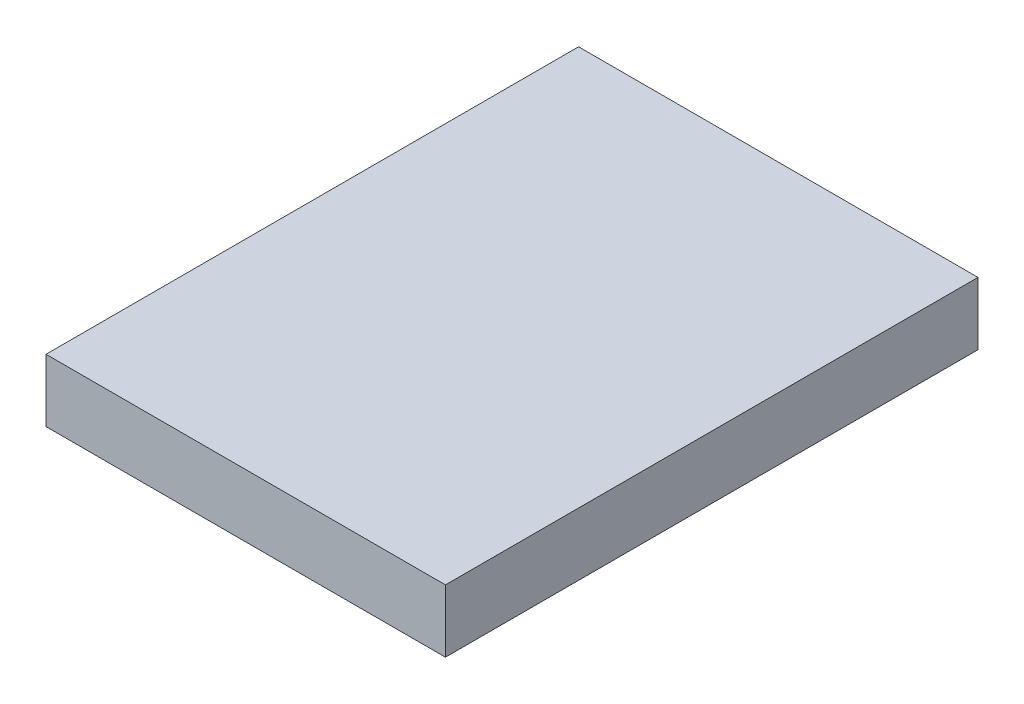
ISO-10303-21;
HEADER;
FILE_DESCRIPTION(('STEP AP214'),'2;1');
FILE_NAME('part.step','',(''),(''),'','','');
FILE_SCHEMA(('AUTOMOTIVE_DESIGN { 1 0 10303 214 1 1 1 1 }'));
ENDSEC;
DATA;
#1=APPLICATION_CONTEXT('core data for automotive mechanical design processes');
#2=APPLICATION_PROTOCOL_DEFINITION('international standard','automotive_design',2000,#1);
#3=PRODUCT_CONTEXT('',#1,'mechanical');
#4=PRODUCT('Part','Part','',(#3));
#5=PRODUCT_RELATED_PRODUCT_CATEGORY('part','',(#4));
#6=PRODUCT_DEFINITION_FORMATION('','',#4);
#7=PRODUCT_DEFINITION_CONTEXT('part definition',#1,'design');
#8=PRODUCT_DEFINITION('design','',#6,#7);
#9=PRODUCT_DEFINITION_SHAPE('','',#8);
#10=(LENGTH_UNIT() NAMED_UNIT(*) SI_UNIT(.MILLI.,.METRE.));
#11=(NAMED_UNIT(*) PLANE_ANGLE_UNIT() SI_UNIT($,.RADIAN.));
#12=(NAMED_UNIT(*) SI_UNIT($,.STERADIAN.) SOLID_ANGLE_UNIT());
#13=UNCERTAINTY_MEASURE_WITH_UNIT(LENGTH_MEASURE(1.E-05),#10,'distance_accuracy_value','');
#14=(GEOMETRIC_REPRESENTATION_CONTEXT(3) GLOBAL_UNCERTAINTY_ASSIGNED_CONTEXT((#13)) GLOBAL_UNIT_ASSIGNED_CONTEXT((#10,
#11,#12)) REPRESENTATION_CONTEXT('',''));
#15=CARTESIAN_POINT('',(0.,0.,0.));
#16=DIRECTION('',(0.,0.,1.));
#17=DIRECTION('',(1.,0.,0.));
#18=AXIS2_PLACEMENT_3D('',#15,#16,#17);
#19=CARTESIAN_POINT('',(38.25,-6.,102.));
#20=DIRECTION('',(-1.,0.,0.));
#21=DIRECTION('',(0.,0.,1.));
#22=AXIS2_PLACEMENT_3D('',#19,#20,#21);
#23=PLANE('',#22);
#24=DIRECTION('',(0.,1.,0.));
#25=VECTOR('',#24,1.);
#26=CARTESIAN_POINT('',(38.25,-6.,0.));
#27=LINE('',#26,#25);
#28=CARTESIAN_POINT('',(38.25,-6.,0.));
#29=VERTEX_POINT('',#28);
#30=CARTESIAN_POINT('',(38.25,6.,0.));
#31=VERTEX_POINT('',#30);
#32=EDGE_CURVE('E96',#29,#31,#27,.T.);
#33=ORIENTED_EDGE('',*,*,#32,.T.);
#34=DIRECTION('',(0.,0.,-1.));
#35=VECTOR('',#34,1.);
#36=CARTESIAN_POINT('',(38.25,6.,102.));
#37=LINE('',#36,#35);
#38=CARTESIAN_POINT('',(38.25,6.,102.));
#39=VERTEX_POINT('',#38);
#40=EDGE_CURVE('E11',#39,#31,#37,.T.);
#41=ORIENTED_EDGE('',*,*,#40,.F.);
#42=DIRECTION('',(0.,1.,0.));
#43=VECTOR('',#42,1.);
#44=CARTESIAN_POINT('',(38.25,-6.,102.));
#45=LINE('',#44,#43);
#46=CARTESIAN_POINT('',(38.25,-6.,102.));
#47=VERTEX_POINT('',#46);
#48=EDGE_CURVE('E84',#47,#39,#45,.T.);
#49=ORIENTED_EDGE('',*,*,#48,.F.);
#50=DIRECTION('',(0.,0.,-1.));
#51=VECTOR('',#50,1.);
#52=CARTESIAN_POINT('',(38.25,-6.,102.));
#53=LINE('',#52,#51);
#54=EDGE_CURVE('E92',#47,#29,#53,.T.);
#55=ORIENTED_EDGE('',*,*,#54,.T.);
#56=EDGE_LOOP('',(#33,#41,#49,#55));
#57=FACE_BOUND('',#56,.T.);
#58=ADVANCED_FACE('F33',(#57),#23,.F.);
#59=CARTESIAN_POINT('',(-38.25,6.,102.));
#60=DIRECTION('',(0.,-1.,0.));
#61=DIRECTION('',(0.,0.,-1.));
#62=AXIS2_PLACEMENT_3D('',#59,#60,#61);
#63=PLANE('',#62);
#64=DIRECTION('',(-1.,0.,0.));
#65=VECTOR('',#64,1.);
#66=CARTESIAN_POINT('',(-38.25,6.,0.));
#67=LINE('',#66,#65);
#68=CARTESIAN_POINT('',(-38.25,6.,0.));
#69=VERTEX_POINT('',#68);
#70=EDGE_CURVE('E88',#31,#69,#67,.T.);
#71=ORIENTED_EDGE('',*,*,#70,.T.);
#72=DIRECTION('',(0.,0.,-1.));
#73=VECTOR('',#72,1.);
#74=CARTESIAN_POINT('',(-38.25,6.,102.));
#75=LINE('',#74,#73);
#76=CARTESIAN_POINT('',(-38.25,6.,102.));
#77=VERTEX_POINT('',#76);
#78=EDGE_CURVE('E41',#77,#69,#75,.T.);
#79=ORIENTED_EDGE('',*,*,#78,.F.);
#80=DIRECTION('',(-1.,0.,0.));
#81=VECTOR('',#80,1.);
#82=CARTESIAN_POINT('',(-38.25,6.,102.));
#83=LINE('',#82,#81);
#84=EDGE_CURVE('E79',#39,#77,#83,.T.);
#85=ORIENTED_EDGE('',*,*,#84,.F.);
#86=ORIENTED_EDGE('',*,*,#40,.T.);
#87=EDGE_LOOP('',(#71,#79,#85,#86));
#88=FACE_BOUND('',#87,.T.);
#89=ADVANCED_FACE('F87',(#88),#63,.F.);
#90=CARTESIAN_POINT('',(-38.25,-6.,102.));
#91=DIRECTION('',(1.,0.,0.));
#92=DIRECTION('',(0.,0.,-1.));
#93=AXIS2_PLACEMENT_3D('',#90,#91,#92);
#94=PLANE('',#93);
#95=DIRECTION('',(0.,-1.,0.));
#96=VECTOR('',#95,1.);
#97=CARTESIAN_POINT('',(-38.25,-6.,0.));
#98=LINE('',#97,#96);
#99=CARTESIAN_POINT('',(-38.25,-6.,0.));
#100=VERTEX_POINT('',#99);
#101=EDGE_CURVE('E66',#69,#100,#98,.T.);
#102=ORIENTED_EDGE('',*,*,#101,.T.);
#103=DIRECTION('',(0.,0.,-1.));
#104=VECTOR('',#103,1.);
#105=CARTESIAN_POINT('',(-38.25,-6.,102.));
#106=LINE('',#105,#104);
#107=CARTESIAN_POINT('',(-38.25,-6.,102.));
#108=VERTEX_POINT('',#107);
#109=EDGE_CURVE('E89',#108,#100,#106,.T.);
#110=ORIENTED_EDGE('',*,*,#109,.F.);
#111=DIRECTION('',(0.,-1.,0.));
#112=VECTOR('',#111,1.);
#113=CARTESIAN_POINT('',(-38.25,-6.,102.));
#114=LINE('',#113,#112);
#115=EDGE_CURVE('E82',#77,#108,#114,.T.);
#116=ORIENTED_EDGE('',*,*,#115,.F.);
#117=ORIENTED_EDGE('',*,*,#78,.T.);
#118=EDGE_LOOP('',(#102,#110,#116,#117));
#119=FACE_BOUND('',#118,.T.);
#120=ADVANCED_FACE('F90',(#119),#94,.F.);
#121=CARTESIAN_POINT('',(-38.25,-6.,102.));
#122=DIRECTION('',(0.,1.,0.));
#123=DIRECTION('',(0.,0.,1.));
#124=AXIS2_PLACEMENT_3D('',#121,#122,#123);
#125=PLANE('',#124);
#126=DIRECTION('',(1.,0.,0.));
#127=VECTOR('',#126,1.);
#128=CARTESIAN_POINT('',(-38.25,-6.,0.));
#129=LINE('',#128,#127);
#130=EDGE_CURVE('E72',#100,#29,#129,.T.);
#131=ORIENTED_EDGE('',*,*,#130,.T.);
#132=ORIENTED_EDGE('',*,*,#54,.F.);
#133=DIRECTION('',(1.,0.,0.));
#134=VECTOR('',#133,1.);
#135=CARTESIAN_POINT('',(-38.25,-6.,102.));
#136=LINE('',#135,#134);
#137=EDGE_CURVE('E49',#108,#47,#136,.T.);
#138=ORIENTED_EDGE('',*,*,#137,.F.);
#139=ORIENTED_EDGE('',*,*,#109,.T.);
#140=EDGE_LOOP('',(#131,#132,#138,#139));
#141=FACE_BOUND('',#140,.T.);
#142=ADVANCED_FACE('F103',(#141),#125,.F.);
#143=CARTESIAN_POINT('',(0.,0.,102.));
#144=DIRECTION('',(0.,0.,-1.));
#145=DIRECTION('',(-1.,0.,0.));
#146=AXIS2_PLACEMENT_3D('',#143,#144,#145);
#147=PLANE('',#146);
#148=ORIENTED_EDGE('',*,*,#48,.T.);
#149=ORIENTED_EDGE('',*,*,#84,.T.);
#150=ORIENTED_EDGE('',*,*,#115,.T.);
#151=ORIENTED_EDGE('',*,*,#137,.T.);
#152=EDGE_LOOP('',(#148,#149,#150,#151));
#153=FACE_BOUND('',#152,.T.);
#154=ADVANCED_FACE('F80',(#153),#147,.F.);
#155=CARTESIAN_POINT('',(0.,0.,0.));
#156=DIRECTION('',(0.,0.,-1.));
#157=DIRECTION('',(-1.,0.,0.));
#158=AXIS2_PLACEMENT_3D('',#155,#156,#157);
#159=PLANE('',#158);
#160=ORIENTED_EDGE('',*,*,#32,.F.);
#161=ORIENTED_EDGE('',*,*,#130,.F.);
#162=ORIENTED_EDGE('',*,*,#101,.F.);
#163=ORIENTED_EDGE('',*,*,#70,.F.);
#164=EDGE_LOOP('',(#160,#161,#162,#163));
#165=FACE_BOUND('',#164,.T.);
#166=ADVANCED_FACE('F106',(#165),#159,.T.);
#167=CLOSED_SHELL('',(#58,#89,#120,#142,#154,#166));
#168=MANIFOLD_SOLID_BREP('B2',#167);
#169=ADVANCED_BREP_SHAPE_REPRESENTATION('',(#18,#168),#14);
#170=SHAPE_DEFINITION_REPRESENTATION(#9,#169);
ENDSEC;
END-ISO-10303-21;
